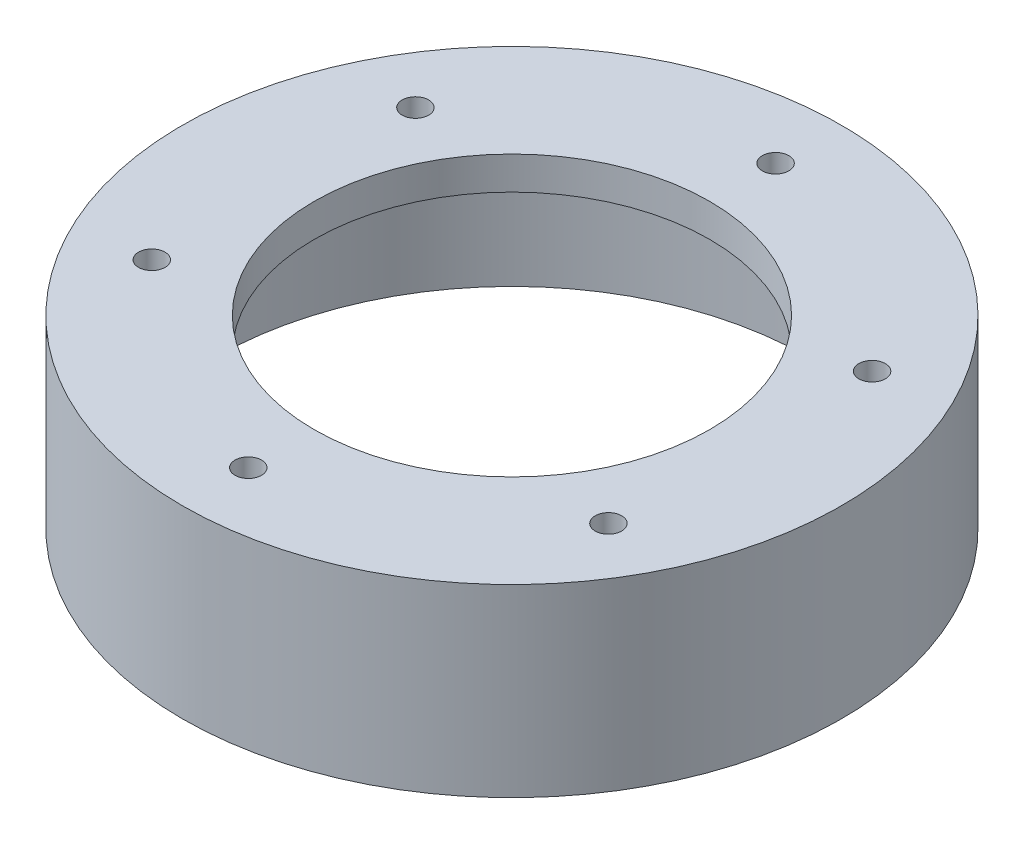
ISO-10303-21;
HEADER;
FILE_DESCRIPTION(('STEP AP214'),'2;1');
FILE_NAME('part.step','',(''),(''),'','','');
FILE_SCHEMA(('AUTOMOTIVE_DESIGN { 1 0 10303 214 1 1 1 1 }'));
ENDSEC;
DATA;
#1=APPLICATION_CONTEXT('core data for automotive mechanical design processes');
#2=APPLICATION_PROTOCOL_DEFINITION('international standard','automotive_design',2000,#1);
#3=PRODUCT_CONTEXT('',#1,'mechanical');
#4=PRODUCT('Part','Part','',(#3));
#5=PRODUCT_RELATED_PRODUCT_CATEGORY('part','',(#4));
#6=PRODUCT_DEFINITION_FORMATION('','',#4);
#7=PRODUCT_DEFINITION_CONTEXT('part definition',#1,'design');
#8=PRODUCT_DEFINITION('design','',#6,#7);
#9=PRODUCT_DEFINITION_SHAPE('','',#8);
#10=(LENGTH_UNIT() NAMED_UNIT(*) SI_UNIT(.MILLI.,.METRE.));
#11=(NAMED_UNIT(*) PLANE_ANGLE_UNIT() SI_UNIT($,.RADIAN.));
#12=(NAMED_UNIT(*) SI_UNIT($,.STERADIAN.) SOLID_ANGLE_UNIT());
#13=UNCERTAINTY_MEASURE_WITH_UNIT(LENGTH_MEASURE(1.E-05),#10,'distance_accuracy_value','');
#14=(GEOMETRIC_REPRESENTATION_CONTEXT(3) GLOBAL_UNCERTAINTY_ASSIGNED_CONTEXT((#13)) GLOBAL_UNIT_ASSIGNED_CONTEXT((#10,
#11,#12)) REPRESENTATION_CONTEXT('',''));
#15=CARTESIAN_POINT('',(0.,0.,0.));
#16=DIRECTION('',(0.,0.,1.));
#17=DIRECTION('',(1.,0.,0.));
#18=AXIS2_PLACEMENT_3D('',#15,#16,#17);
#19=CARTESIAN_POINT('',(0.,35.56,0.));
#20=DIRECTION('',(0.,-1.,0.));
#21=DIRECTION('',(0.,0.,-1.));
#22=AXIS2_PLACEMENT_3D('',#19,#20,#21);
#23=CYLINDRICAL_SURFACE('',#22,38.1);
#24=CARTESIAN_POINT('',(0.,35.56,0.));
#25=DIRECTION('',(0.,1.,0.));
#26=DIRECTION('',(0.,0.,1.));
#27=AXIS2_PLACEMENT_3D('',#24,#25,#26);
#28=CIRCLE('',#27,38.1);
#29=CARTESIAN_POINT('',(0.,35.56,38.1));
#30=VERTEX_POINT('',#29);
#31=EDGE_CURVE('E44',#30,#30,#28,.T.);
#32=ORIENTED_EDGE('',*,*,#31,.T.);
#33=EDGE_LOOP('',(#32));
#34=FACE_BOUND('',#33,.T.);
#35=CARTESIAN_POINT('',(0.,29.21,0.));
#36=DIRECTION('',(0.,-1.,0.));
#37=DIRECTION('',(0.,0.,-1.));
#38=AXIS2_PLACEMENT_3D('',#35,#36,#37);
#39=CIRCLE('',#38,38.1);
#40=CARTESIAN_POINT('',(0.,29.21,-38.1));
#41=VERTEX_POINT('',#40);
#42=EDGE_CURVE('E35',#41,#41,#39,.T.);
#43=ORIENTED_EDGE('',*,*,#42,.T.);
#44=EDGE_LOOP('',(#43));
#45=FACE_BOUND('',#44,.T.);
#46=ADVANCED_FACE('F31',(#34,#45),#23,.F.);
#47=CARTESIAN_POINT('',(0.,35.56,0.));
#48=DIRECTION('',(0.,1.,0.));
#49=DIRECTION('',(0.,0.,1.));
#50=AXIS2_PLACEMENT_3D('',#47,#48,#49);
#51=PLANE('',#50);
#52=CARTESIAN_POINT('',(43.9940905122492,35.56,-25.4000000000005));
#53=DIRECTION('',(0.,1.,0.));
#54=DIRECTION('',(0.,0.,1.));
#55=AXIS2_PLACEMENT_3D('',#52,#53,#54);
#56=CIRCLE('',#55,2.5527);
#57=CARTESIAN_POINT('',(43.9940905122492,35.56,-22.8473000000005));
#58=VERTEX_POINT('',#57);
#59=EDGE_CURVE('E87',#58,#58,#56,.T.);
#60=ORIENTED_EDGE('',*,*,#59,.F.);
#61=EDGE_LOOP('',(#60));
#62=FACE_BOUND('',#61,.T.);
#63=CARTESIAN_POINT('',(43.9940905122497,35.56,25.3999999999996));
#64=DIRECTION('',(0.,1.,0.));
#65=DIRECTION('',(0.,0.,1.));
#66=AXIS2_PLACEMENT_3D('',#63,#64,#65);
#67=CIRCLE('',#66,2.5527);
#68=CARTESIAN_POINT('',(43.9940905122497,35.56,27.9526999999996));
#69=VERTEX_POINT('',#68);
#70=EDGE_CURVE('E81',#69,#69,#67,.T.);
#71=ORIENTED_EDGE('',*,*,#70,.F.);
#72=EDGE_LOOP('',(#71));
#73=FACE_BOUND('',#72,.T.);
#74=CARTESIAN_POINT('',(0.,35.56,50.8));
#75=DIRECTION('',(0.,1.,0.));
#76=DIRECTION('',(0.,0.,1.));
#77=AXIS2_PLACEMENT_3D('',#74,#75,#76);
#78=CIRCLE('',#77,2.5527);
#79=CARTESIAN_POINT('',(0.,35.56,53.3527));
#80=VERTEX_POINT('',#79);
#81=EDGE_CURVE('E75',#80,#80,#78,.T.);
#82=ORIENTED_EDGE('',*,*,#81,.F.);
#83=EDGE_LOOP('',(#82));
#84=FACE_BOUND('',#83,.T.);
#85=CARTESIAN_POINT('',(-43.9940905122494,35.56,25.4000000000002));
#86=DIRECTION('',(0.,1.,0.));
#87=DIRECTION('',(0.,0.,1.));
#88=AXIS2_PLACEMENT_3D('',#85,#86,#87);
#89=CIRCLE('',#88,2.5527);
#90=CARTESIAN_POINT('',(-43.9940905122494,35.56,27.9527000000002));
#91=VERTEX_POINT('',#90);
#92=EDGE_CURVE('E69',#91,#91,#89,.T.);
#93=ORIENTED_EDGE('',*,*,#92,.F.);
#94=EDGE_LOOP('',(#93));
#95=FACE_BOUND('',#94,.T.);
#96=CARTESIAN_POINT('',(-43.9940905122495,35.56,-25.3999999999999));
#97=DIRECTION('',(0.,1.,0.));
#98=DIRECTION('',(0.,0.,1.));
#99=AXIS2_PLACEMENT_3D('',#96,#97,#98);
#100=CIRCLE('',#99,2.5527);
#101=CARTESIAN_POINT('',(-43.9940905122495,35.56,-22.8472999999999));
#102=VERTEX_POINT('',#101);
#103=EDGE_CURVE('E63',#102,#102,#100,.T.);
#104=ORIENTED_EDGE('',*,*,#103,.F.);
#105=EDGE_LOOP('',(#104));
#106=FACE_BOUND('',#105,.T.);
#107=CARTESIAN_POINT('',(0.,35.56,-50.8));
#108=DIRECTION('',(0.,1.,0.));
#109=DIRECTION('',(0.,0.,1.));
#110=AXIS2_PLACEMENT_3D('',#107,#108,#109);
#111=CIRCLE('',#110,2.5527);
#112=CARTESIAN_POINT('',(0.,35.56,-48.2473));
#113=VERTEX_POINT('',#112);
#114=EDGE_CURVE('E57',#113,#113,#111,.T.);
#115=ORIENTED_EDGE('',*,*,#114,.F.);
#116=EDGE_LOOP('',(#115));
#117=FACE_BOUND('',#116,.T.);
#118=CARTESIAN_POINT('',(0.,35.56,0.));
#119=DIRECTION('',(0.,1.,0.));
#120=DIRECTION('',(0.,0.,1.));
#121=AXIS2_PLACEMENT_3D('',#118,#119,#120);
#122=CIRCLE('',#121,63.5);
#123=CARTESIAN_POINT('',(0.,35.56,63.5));
#124=VERTEX_POINT('',#123);
#125=EDGE_CURVE('E10',#124,#124,#122,.T.);
#126=ORIENTED_EDGE('',*,*,#125,.T.);
#127=EDGE_LOOP('',(#126));
#128=FACE_BOUND('',#127,.T.);
#129=ORIENTED_EDGE('',*,*,#31,.F.);
#130=EDGE_LOOP('',(#129));
#131=FACE_BOUND('',#130,.T.);
#132=ADVANCED_FACE('F94',(#62,#73,#84,#95,#106,#117,#128,#131),#51,.T.);
#133=CARTESIAN_POINT('',(0.,0.,0.));
#134=DIRECTION('',(0.,1.,0.));
#135=DIRECTION('',(0.,0.,1.));
#136=AXIS2_PLACEMENT_3D('',#133,#134,#135);
#137=PLANE('',#136);
#138=CARTESIAN_POINT('',(0.,0.,0.));
#139=DIRECTION('',(0.,-1.,0.));
#140=DIRECTION('',(0.,0.,-1.));
#141=AXIS2_PLACEMENT_3D('',#138,#139,#140);
#142=CIRCLE('',#141,57.15);
#143=CARTESIAN_POINT('',(0.,0.,-57.15));
#144=VERTEX_POINT('',#143);
#145=EDGE_CURVE('E48',#144,#144,#142,.T.);
#146=ORIENTED_EDGE('',*,*,#145,.F.);
#147=EDGE_LOOP('',(#146));
#148=FACE_BOUND('',#147,.T.);
#149=CARTESIAN_POINT('',(0.,0.,0.));
#150=DIRECTION('',(0.,1.,0.));
#151=DIRECTION('',(0.,0.,1.));
#152=AXIS2_PLACEMENT_3D('',#149,#150,#151);
#153=CIRCLE('',#152,63.5);
#154=CARTESIAN_POINT('',(0.,0.,63.5));
#155=VERTEX_POINT('',#154);
#156=EDGE_CURVE('E39',#155,#155,#153,.T.);
#157=ORIENTED_EDGE('',*,*,#156,.F.);
#158=EDGE_LOOP('',(#157));
#159=FACE_BOUND('',#158,.T.);
#160=ADVANCED_FACE('F97',(#148,#159),#137,.F.);
#161=CARTESIAN_POINT('',(0.,35.56,0.));
#162=DIRECTION('',(0.,-1.,0.));
#163=DIRECTION('',(0.,0.,-1.));
#164=AXIS2_PLACEMENT_3D('',#161,#162,#163);
#165=CYLINDRICAL_SURFACE('',#164,63.5);
#166=ORIENTED_EDGE('',*,*,#125,.F.);
#167=EDGE_LOOP('',(#166));
#168=FACE_BOUND('',#167,.T.);
#169=ORIENTED_EDGE('',*,*,#156,.T.);
#170=EDGE_LOOP('',(#169));
#171=FACE_BOUND('',#170,.T.);
#172=ADVANCED_FACE('F33',(#168,#171),#165,.T.);
#173=CARTESIAN_POINT('',(0.,29.21,0.));
#174=DIRECTION('',(0.,-1.,0.));
#175=DIRECTION('',(0.,0.,-1.));
#176=AXIS2_PLACEMENT_3D('',#173,#174,#175);
#177=CYLINDRICAL_SURFACE('',#176,57.15);
#178=CARTESIAN_POINT('',(0.,29.21,0.));
#179=DIRECTION('',(0.,-1.,0.));
#180=DIRECTION('',(0.,0.,-1.));
#181=AXIS2_PLACEMENT_3D('',#178,#179,#180);
#182=CIRCLE('',#181,57.15);
#183=CARTESIAN_POINT('',(0.,29.21,-57.15));
#184=VERTEX_POINT('',#183);
#185=EDGE_CURVE('E51',#184,#184,#182,.T.);
#186=CARTESIAN_POINT('',(0.,29.21,-57.15));
#187=CARTESIAN_POINT('',(0.,28.9057291666667,-57.15));
#188=CARTESIAN_POINT('',(0.,28.6014583333333,-57.15));
#189=CARTESIAN_POINT('',(0.,27.9929166666667,-57.15));
#190=CARTESIAN_POINT('',(0.,27.6886458333333,-57.15));
#191=CARTESIAN_POINT('',(0.,27.0801041666667,-57.15));
#192=CARTESIAN_POINT('',(0.,26.7758333333333,-57.15));
#193=CARTESIAN_POINT('',(0.,26.1672916666667,-57.15));
#194=CARTESIAN_POINT('',(0.,25.8630208333333,-57.15));
#195=CARTESIAN_POINT('',(0.,25.2544791666667,-57.15));
#196=CARTESIAN_POINT('',(0.,24.9502083333333,-57.15));
#197=CARTESIAN_POINT('',(0.,24.3416666666667,-57.15));
#198=CARTESIAN_POINT('',(0.,24.0373958333333,-57.15));
#199=CARTESIAN_POINT('',(0.,23.4288541666667,-57.15));
#200=CARTESIAN_POINT('',(0.,23.1245833333333,-57.15));
#201=CARTESIAN_POINT('',(0.,22.5160416666667,-57.15));
#202=CARTESIAN_POINT('',(0.,22.2117708333333,-57.15));
#203=CARTESIAN_POINT('',(0.,21.6032291666667,-57.15));
#204=CARTESIAN_POINT('',(0.,21.2989583333333,-57.15));
#205=CARTESIAN_POINT('',(0.,20.6904166666667,-57.15));
#206=CARTESIAN_POINT('',(0.,20.3861458333333,-57.15));
#207=CARTESIAN_POINT('',(0.,19.7776041666667,-57.15));
#208=CARTESIAN_POINT('',(0.,19.4733333333333,-57.15));
#209=CARTESIAN_POINT('',(0.,18.8647916666667,-57.15));
#210=CARTESIAN_POINT('',(0.,18.5605208333333,-57.15));
#211=CARTESIAN_POINT('',(0.,17.9519791666667,-57.15));
#212=CARTESIAN_POINT('',(0.,17.6477083333333,-57.15));
#213=CARTESIAN_POINT('',(0.,17.0391666666667,-57.15));
#214=CARTESIAN_POINT('',(0.,16.7348958333333,-57.15));
#215=CARTESIAN_POINT('',(0.,16.1263541666667,-57.15));
#216=CARTESIAN_POINT('',(0.,15.8220833333333,-57.15));
#217=CARTESIAN_POINT('',(0.,15.2135416666667,-57.15));
#218=CARTESIAN_POINT('',(0.,14.9092708333333,-57.15));
#219=CARTESIAN_POINT('',(0.,14.3007291666667,-57.15));
#220=CARTESIAN_POINT('',(0.,13.9964583333333,-57.15));
#221=CARTESIAN_POINT('',(0.,13.3879166666667,-57.15));
#222=CARTESIAN_POINT('',(0.,13.0836458333333,-57.15));
#223=CARTESIAN_POINT('',(0.,12.4751041666667,-57.15));
#224=CARTESIAN_POINT('',(0.,12.1708333333333,-57.15));
#225=CARTESIAN_POINT('',(0.,11.5622916666667,-57.15));
#226=CARTESIAN_POINT('',(0.,11.2580208333333,-57.15));
#227=CARTESIAN_POINT('',(0.,10.6494791666667,-57.15));
#228=CARTESIAN_POINT('',(0.,10.3452083333333,-57.15));
#229=CARTESIAN_POINT('',(0.,9.73666666666667,-57.15));
#230=CARTESIAN_POINT('',(0.,9.43239583333333,-57.15));
#231=CARTESIAN_POINT('',(0.,8.82385416666667,-57.15));
#232=CARTESIAN_POINT('',(0.,8.51958333333333,-57.15));
#233=CARTESIAN_POINT('',(0.,7.91104166666666,-57.15));
#234=CARTESIAN_POINT('',(0.,7.60677083333333,-57.15));
#235=CARTESIAN_POINT('',(0.,6.99822916666667,-57.15));
#236=CARTESIAN_POINT('',(0.,6.69395833333333,-57.15));
#237=CARTESIAN_POINT('',(0.,6.08541666666667,-57.15));
#238=CARTESIAN_POINT('',(0.,5.78114583333333,-57.15));
#239=CARTESIAN_POINT('',(0.,5.17260416666667,-57.15));
#240=CARTESIAN_POINT('',(0.,4.86833333333333,-57.15));
#241=CARTESIAN_POINT('',(0.,4.25979166666667,-57.15));
#242=CARTESIAN_POINT('',(0.,3.95552083333333,-57.15));
#243=CARTESIAN_POINT('',(0.,3.34697916666667,-57.15));
#244=CARTESIAN_POINT('',(0.,3.04270833333333,-57.15));
#245=CARTESIAN_POINT('',(0.,2.43416666666667,-57.15));
#246=CARTESIAN_POINT('',(0.,2.12989583333333,-57.15));
#247=CARTESIAN_POINT('',(0.,1.52135416666667,-57.15));
#248=CARTESIAN_POINT('',(0.,1.21708333333333,-57.15));
#249=CARTESIAN_POINT('',(0.,0.608541666666666,-57.15));
#250=CARTESIAN_POINT('',(0.,0.304270833333333,-57.15));
#251=CARTESIAN_POINT('',(0.,0.,-57.15));
#252=B_SPLINE_CURVE_WITH_KNOTS('',3,(#186,#187,#188,#189,#190,#191,#192,#193,#194,#195,#196,
#197,#198,#199,#200,#201,#202,#203,#204,#205,#206,#207,#208,#209,#210,#211,#212,#213,#214,#215,
#216,#217,#218,#219,#220,#221,#222,#223,#224,#225,#226,#227,#228,#229,#230,#231,#232,#233,#234,
#235,#236,#237,#238,#239,#240,#241,#242,#243,#244,#245,#246,#247,#248,#249,#250,#251),
.UNSPECIFIED.,.F.,.F.,(4,2,2,2,2,2,2,2,2,2,2,2,2,2,2,2,2,2,2,2,2,2,2,2,2,2,2,2,2,2,2,2,4),(0.,
0.912812499999999,1.825625,2.7384375,3.65125,4.5640625,5.476875,6.3896875,7.3025,8.2153125,
9.128125,10.0409375,10.95375,11.8665625,12.779375,13.6921875,14.605,15.5178125,16.430625,
17.3434375,18.25625,19.1690625,20.081875,20.9946875,21.9075,22.8203125,23.733125,24.6459375,
25.55875,26.4715625,27.384375,28.2971875,29.21),.UNSPECIFIED.);
#253=EDGE_CURVE('BSEAM121',#184,#144,#252,.T.);
#254=ORIENTED_EDGE('',*,*,#185,.F.);
#255=ORIENTED_EDGE('',*,*,#145,.T.);
#256=ORIENTED_EDGE('',*,*,#253,.T.);
#257=ORIENTED_EDGE('',*,*,#253,.F.);
#258=EDGE_LOOP('',(#254,#256,#255,#257));
#259=FACE_BOUND('',#258,.T.);
#260=ADVANCED_FACE('F121',(#259),#177,.F.);
#261=CARTESIAN_POINT('',(0.,29.21,0.));
#262=DIRECTION('',(0.,-1.,0.));
#263=DIRECTION('',(0.,0.,-1.));
#264=AXIS2_PLACEMENT_3D('',#261,#262,#263);
#265=PLANE('',#264);
#266=CARTESIAN_POINT('',(43.9940905122492,29.21,-25.4000000000005));
#267=DIRECTION('',(0.,-1.,0.));
#268=DIRECTION('',(0.,0.,-1.));
#269=AXIS2_PLACEMENT_3D('',#266,#267,#268);
#270=CIRCLE('',#269,2.5527);
#271=CARTESIAN_POINT('',(43.9940905122492,29.21,-27.9527000000005));
#272=VERTEX_POINT('',#271);
#273=EDGE_CURVE('E84',#272,#272,#270,.T.);
#274=ORIENTED_EDGE('',*,*,#273,.F.);
#275=EDGE_LOOP('',(#274));
#276=FACE_BOUND('',#275,.T.);
#277=CARTESIAN_POINT('',(43.9940905122497,29.21,25.3999999999996));
#278=DIRECTION('',(0.,-1.,0.));
#279=DIRECTION('',(0.,0.,-1.));
#280=AXIS2_PLACEMENT_3D('',#277,#278,#279);
#281=CIRCLE('',#280,2.5527);
#282=CARTESIAN_POINT('',(43.9940905122497,29.21,22.8472999999996));
#283=VERTEX_POINT('',#282);
#284=EDGE_CURVE('E78',#283,#283,#281,.T.);
#285=ORIENTED_EDGE('',*,*,#284,.F.);
#286=EDGE_LOOP('',(#285));
#287=FACE_BOUND('',#286,.T.);
#288=CARTESIAN_POINT('',(0.,29.21,50.8));
#289=DIRECTION('',(0.,-1.,0.));
#290=DIRECTION('',(0.,0.,-1.));
#291=AXIS2_PLACEMENT_3D('',#288,#289,#290);
#292=CIRCLE('',#291,2.5527);
#293=CARTESIAN_POINT('',(0.,29.21,48.2473));
#294=VERTEX_POINT('',#293);
#295=EDGE_CURVE('E72',#294,#294,#292,.T.);
#296=ORIENTED_EDGE('',*,*,#295,.F.);
#297=EDGE_LOOP('',(#296));
#298=FACE_BOUND('',#297,.T.);
#299=CARTESIAN_POINT('',(-43.9940905122494,29.21,25.4000000000002));
#300=DIRECTION('',(0.,-1.,0.));
#301=DIRECTION('',(0.,0.,-1.));
#302=AXIS2_PLACEMENT_3D('',#299,#300,#301);
#303=CIRCLE('',#302,2.5527);
#304=CARTESIAN_POINT('',(-43.9940905122494,29.21,22.8473000000002));
#305=VERTEX_POINT('',#304);
#306=EDGE_CURVE('E66',#305,#305,#303,.T.);
#307=ORIENTED_EDGE('',*,*,#306,.F.);
#308=EDGE_LOOP('',(#307));
#309=FACE_BOUND('',#308,.T.);
#310=CARTESIAN_POINT('',(-43.9940905122495,29.21,-25.3999999999999));
#311=DIRECTION('',(0.,-1.,0.));
#312=DIRECTION('',(0.,0.,-1.));
#313=AXIS2_PLACEMENT_3D('',#310,#311,#312);
#314=CIRCLE('',#313,2.5527);
#315=CARTESIAN_POINT('',(-43.9940905122495,29.21,-27.9526999999999));
#316=VERTEX_POINT('',#315);
#317=EDGE_CURVE('E60',#316,#316,#314,.T.);
#318=ORIENTED_EDGE('',*,*,#317,.F.);
#319=EDGE_LOOP('',(#318));
#320=FACE_BOUND('',#319,.T.);
#321=CARTESIAN_POINT('',(0.,29.21,-50.8));
#322=DIRECTION('',(0.,-1.,0.));
#323=DIRECTION('',(0.,0.,-1.));
#324=AXIS2_PLACEMENT_3D('',#321,#322,#323);
#325=CIRCLE('',#324,2.5527);
#326=CARTESIAN_POINT('',(0.,29.21,-53.3527));
#327=VERTEX_POINT('',#326);
#328=EDGE_CURVE('E52',#327,#327,#325,.T.);
#329=ORIENTED_EDGE('',*,*,#328,.F.);
#330=EDGE_LOOP('',(#329));
#331=FACE_BOUND('',#330,.T.);
#332=ORIENTED_EDGE('',*,*,#42,.F.);
#333=EDGE_LOOP('',(#332));
#334=FACE_BOUND('',#333,.T.);
#335=ORIENTED_EDGE('',*,*,#185,.T.);
#336=EDGE_LOOP('',(#335));
#337=FACE_BOUND('',#336,.T.);
#338=ADVANCED_FACE('F117',(#276,#287,#298,#309,#320,#331,#334,#337),#265,.T.);
#339=CARTESIAN_POINT('',(0.,35.56,-50.8));
#340=DIRECTION('',(0.,1.,0.));
#341=DIRECTION('',(0.,0.,1.));
#342=AXIS2_PLACEMENT_3D('',#339,#340,#341);
#343=CYLINDRICAL_SURFACE('',#342,2.5527);
#344=ORIENTED_EDGE('',*,*,#114,.T.);
#345=EDGE_LOOP('',(#344));
#346=FACE_BOUND('',#345,.T.);
#347=ORIENTED_EDGE('',*,*,#328,.T.);
#348=EDGE_LOOP('',(#347));
#349=FACE_BOUND('',#348,.T.);
#350=ADVANCED_FACE('F120',(#346,#349),#343,.F.);
#351=CARTESIAN_POINT('',(-43.9940905122495,35.56,-25.3999999999999));
#352=DIRECTION('',(0.,1.,0.));
#353=DIRECTION('',(0.,0.,1.));
#354=AXIS2_PLACEMENT_3D('',#351,#352,#353);
#355=CYLINDRICAL_SURFACE('',#354,2.5527);
#356=ORIENTED_EDGE('',*,*,#103,.T.);
#357=EDGE_LOOP('',(#356));
#358=FACE_BOUND('',#357,.T.);
#359=ORIENTED_EDGE('',*,*,#317,.T.);
#360=EDGE_LOOP('',(#359));
#361=FACE_BOUND('',#360,.T.);
#362=ADVANCED_FACE('F158',(#358,#361),#355,.F.);
#363=CARTESIAN_POINT('',(-43.9940905122494,35.56,25.4000000000002));
#364=DIRECTION('',(0.,1.,0.));
#365=DIRECTION('',(0.,0.,1.));
#366=AXIS2_PLACEMENT_3D('',#363,#364,#365);
#367=CYLINDRICAL_SURFACE('',#366,2.5527);
#368=ORIENTED_EDGE('',*,*,#92,.T.);
#369=EDGE_LOOP('',(#368));
#370=FACE_BOUND('',#369,.T.);
#371=ORIENTED_EDGE('',*,*,#306,.T.);
#372=EDGE_LOOP('',(#371));
#373=FACE_BOUND('',#372,.T.);
#374=ADVANCED_FACE('F165',(#370,#373),#367,.F.);
#375=CARTESIAN_POINT('',(0.,35.56,50.8));
#376=DIRECTION('',(0.,1.,0.));
#377=DIRECTION('',(0.,0.,1.));
#378=AXIS2_PLACEMENT_3D('',#375,#376,#377);
#379=CYLINDRICAL_SURFACE('',#378,2.5527);
#380=ORIENTED_EDGE('',*,*,#81,.T.);
#381=EDGE_LOOP('',(#380));
#382=FACE_BOUND('',#381,.T.);
#383=ORIENTED_EDGE('',*,*,#295,.T.);
#384=EDGE_LOOP('',(#383));
#385=FACE_BOUND('',#384,.T.);
#386=ADVANCED_FACE('F173',(#382,#385),#379,.F.);
#387=CARTESIAN_POINT('',(43.9940905122497,35.56,25.3999999999996));
#388=DIRECTION('',(0.,1.,0.));
#389=DIRECTION('',(0.,0.,1.));
#390=AXIS2_PLACEMENT_3D('',#387,#388,#389);
#391=CYLINDRICAL_SURFACE('',#390,2.5527);
#392=ORIENTED_EDGE('',*,*,#70,.T.);
#393=EDGE_LOOP('',(#392));
#394=FACE_BOUND('',#393,.T.);
#395=ORIENTED_EDGE('',*,*,#284,.T.);
#396=EDGE_LOOP('',(#395));
#397=FACE_BOUND('',#396,.T.);
#398=ADVANCED_FACE('F181',(#394,#397),#391,.F.);
#399=CARTESIAN_POINT('',(43.9940905122492,35.56,-25.4000000000005));
#400=DIRECTION('',(0.,1.,0.));
#401=DIRECTION('',(0.,0.,1.));
#402=AXIS2_PLACEMENT_3D('',#399,#400,#401);
#403=CYLINDRICAL_SURFACE('',#402,2.5527);
#404=ORIENTED_EDGE('',*,*,#59,.T.);
#405=EDGE_LOOP('',(#404));
#406=FACE_BOUND('',#405,.T.);
#407=ORIENTED_EDGE('',*,*,#273,.T.);
#408=EDGE_LOOP('',(#407));
#409=FACE_BOUND('',#408,.T.);
#410=ADVANCED_FACE('F91',(#406,#409),#403,.F.);
#411=CLOSED_SHELL('',(#46,#132,#160,#172,#260,#338,#350,#362,#374,#386,#398,#410));
#412=MANIFOLD_SOLID_BREP('B2',#411);
#413=ADVANCED_BREP_SHAPE_REPRESENTATION('',(#18,#412),#14);
#414=SHAPE_DEFINITION_REPRESENTATION(#9,#413);
ENDSEC;
END-ISO-10303-21;
